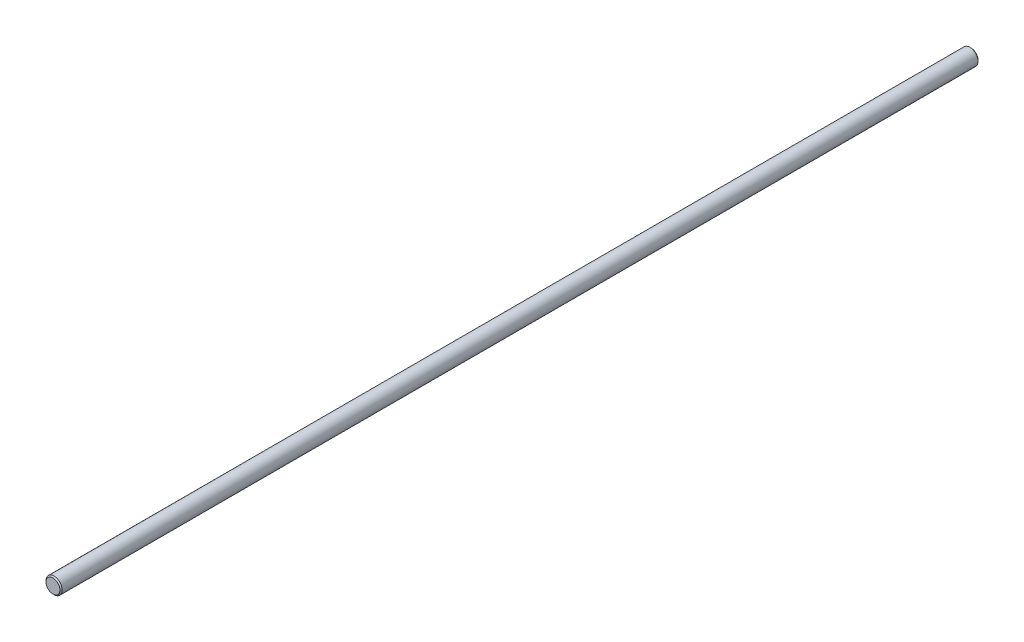
ISO-10303-21;
HEADER;
FILE_DESCRIPTION(('STEP AP214'),'2;1');
FILE_NAME('part.step','',(''),(''),'','','');
FILE_SCHEMA(('AUTOMOTIVE_DESIGN { 1 0 10303 214 1 1 1 1 }'));
ENDSEC;
DATA;
#1=APPLICATION_CONTEXT('core data for automotive mechanical design processes');
#2=APPLICATION_PROTOCOL_DEFINITION('international standard','automotive_design',2000,#1);
#3=PRODUCT_CONTEXT('',#1,'mechanical');
#4=PRODUCT('Part','Part','',(#3));
#5=PRODUCT_RELATED_PRODUCT_CATEGORY('part','',(#4));
#6=PRODUCT_DEFINITION_FORMATION('','',#4);
#7=PRODUCT_DEFINITION_CONTEXT('part definition',#1,'design');
#8=PRODUCT_DEFINITION('design','',#6,#7);
#9=PRODUCT_DEFINITION_SHAPE('','',#8);
#10=(LENGTH_UNIT() NAMED_UNIT(*) SI_UNIT(.MILLI.,.METRE.));
#11=(NAMED_UNIT(*) PLANE_ANGLE_UNIT() SI_UNIT($,.RADIAN.));
#12=(NAMED_UNIT(*) SI_UNIT($,.STERADIAN.) SOLID_ANGLE_UNIT());
#13=UNCERTAINTY_MEASURE_WITH_UNIT(LENGTH_MEASURE(1.E-05),#10,'distance_accuracy_value','');
#14=(GEOMETRIC_REPRESENTATION_CONTEXT(3) GLOBAL_UNCERTAINTY_ASSIGNED_CONTEXT((#13)) GLOBAL_UNIT_ASSIGNED_CONTEXT((#10,
#11,#12)) REPRESENTATION_CONTEXT('',''));
#15=CARTESIAN_POINT('',(0.,0.,0.));
#16=DIRECTION('',(0.,0.,1.));
#17=DIRECTION('',(1.,0.,0.));
#18=AXIS2_PLACEMENT_3D('',#15,#16,#17);
#19=CARTESIAN_POINT('',(0.,0.,-150.));
#20=DIRECTION('',(0.,0.,1.));
#21=DIRECTION('',(1.,0.,0.));
#22=AXIS2_PLACEMENT_3D('',#19,#20,#21);
#23=CYLINDRICAL_SURFACE('',#22,3.);
#24=CARTESIAN_POINT('',(0.,0.,-149.58));
#25=DIRECTION('',(0.,0.,1.));
#26=DIRECTION('',(1.,0.,0.));
#27=AXIS2_PLACEMENT_3D('',#24,#25,#26);
#28=CIRCLE('',#27,3.);
#29=CARTESIAN_POINT('',(3.,0.,-149.58));
#30=VERTEX_POINT('',#29);
#31=EDGE_CURVE('E48',#30,#30,#28,.T.);
#32=CARTESIAN_POINT('',(0.,0.,189.58));
#33=DIRECTION('',(0.,0.,1.));
#34=DIRECTION('',(1.,0.,0.));
#35=AXIS2_PLACEMENT_3D('',#32,#33,#34);
#36=CIRCLE('',#35,3.);
#37=CARTESIAN_POINT('',(3.,0.,189.58));
#38=VERTEX_POINT('',#37);
#39=EDGE_CURVE('E52',#38,#38,#36,.F.);
#40=CARTESIAN_POINT('',(3.,0.,-149.58));
#41=CARTESIAN_POINT('',(3.,0.,-146.047083333333));
#42=CARTESIAN_POINT('',(3.,0.,-142.514166666667));
#43=CARTESIAN_POINT('',(3.,0.,-135.448333333333));
#44=CARTESIAN_POINT('',(3.,0.,-131.915416666667));
#45=CARTESIAN_POINT('',(3.,0.,-124.849583333333));
#46=CARTESIAN_POINT('',(3.,0.,-121.316666666667));
#47=CARTESIAN_POINT('',(3.,0.,-114.250833333333));
#48=CARTESIAN_POINT('',(3.,0.,-110.717916666667));
#49=CARTESIAN_POINT('',(3.,0.,-103.652083333333));
#50=CARTESIAN_POINT('',(3.,0.,-100.119166666667));
#51=CARTESIAN_POINT('',(3.,0.,-93.0533333333334));
#52=CARTESIAN_POINT('',(3.,0.,-89.5204166666667));
#53=CARTESIAN_POINT('',(3.,0.,-82.4545833333334));
#54=CARTESIAN_POINT('',(3.,0.,-78.9216666666667));
#55=CARTESIAN_POINT('',(3.,0.,-71.8558333333334));
#56=CARTESIAN_POINT('',(3.,0.,-68.3229166666667));
#57=CARTESIAN_POINT('',(3.,0.,-61.2570833333334));
#58=CARTESIAN_POINT('',(3.,0.,-57.7241666666667));
#59=CARTESIAN_POINT('',(3.,0.,-50.6583333333334));
#60=CARTESIAN_POINT('',(3.,0.,-47.1254166666667));
#61=CARTESIAN_POINT('',(3.,0.,-40.0595833333334));
#62=CARTESIAN_POINT('',(3.,0.,-36.5266666666667));
#63=CARTESIAN_POINT('',(3.,0.,-29.4608333333334));
#64=CARTESIAN_POINT('',(3.,0.,-25.9279166666667));
#65=CARTESIAN_POINT('',(3.,0.,-18.8620833333334));
#66=CARTESIAN_POINT('',(3.,0.,-15.3291666666667));
#67=CARTESIAN_POINT('',(3.,0.,-8.26333333333337));
#68=CARTESIAN_POINT('',(3.,0.,-4.73041666666671));
#69=CARTESIAN_POINT('',(3.,0.,2.33541666666662));
#70=CARTESIAN_POINT('',(3.,0.,5.86833333333328));
#71=CARTESIAN_POINT('',(3.,0.,12.9341666666666));
#72=CARTESIAN_POINT('',(3.,0.,16.4670833333333));
#73=CARTESIAN_POINT('',(3.,0.,23.5329166666666));
#74=CARTESIAN_POINT('',(3.,0.,27.0658333333333));
#75=CARTESIAN_POINT('',(3.,0.,34.1316666666666));
#76=CARTESIAN_POINT('',(3.,0.,37.6645833333333));
#77=CARTESIAN_POINT('',(3.,0.,44.7304166666666));
#78=CARTESIAN_POINT('',(3.,0.,48.2633333333333));
#79=CARTESIAN_POINT('',(3.,0.,55.3291666666666));
#80=CARTESIAN_POINT('',(3.,0.,58.8620833333333));
#81=CARTESIAN_POINT('',(3.,0.,65.9279166666666));
#82=CARTESIAN_POINT('',(3.,0.,69.4608333333333));
#83=CARTESIAN_POINT('',(3.,0.,76.5266666666666));
#84=CARTESIAN_POINT('',(3.,0.,80.0595833333333));
#85=CARTESIAN_POINT('',(3.,0.,87.1254166666667));
#86=CARTESIAN_POINT('',(3.,0.,90.6583333333333));
#87=CARTESIAN_POINT('',(3.,0.,97.7241666666666));
#88=CARTESIAN_POINT('',(3.,0.,101.257083333333));
#89=CARTESIAN_POINT('',(3.,0.,108.322916666667));
#90=CARTESIAN_POINT('',(3.,0.,111.855833333333));
#91=CARTESIAN_POINT('',(3.,0.,118.921666666667));
#92=CARTESIAN_POINT('',(3.,0.,122.454583333333));
#93=CARTESIAN_POINT('',(3.,0.,129.520416666667));
#94=CARTESIAN_POINT('',(3.,0.,133.053333333333));
#95=CARTESIAN_POINT('',(3.,0.,140.119166666667));
#96=CARTESIAN_POINT('',(3.,0.,143.652083333333));
#97=CARTESIAN_POINT('',(3.,0.,150.717916666667));
#98=CARTESIAN_POINT('',(3.,0.,154.250833333333));
#99=CARTESIAN_POINT('',(3.,0.,161.316666666667));
#100=CARTESIAN_POINT('',(3.,0.,164.849583333333));
#101=CARTESIAN_POINT('',(3.,0.,171.915416666667));
#102=CARTESIAN_POINT('',(3.,0.,175.448333333333));
#103=CARTESIAN_POINT('',(3.,0.,182.514166666667));
#104=CARTESIAN_POINT('',(3.,0.,186.047083333333));
#105=CARTESIAN_POINT('',(3.,0.,189.58));
#106=B_SPLINE_CURVE_WITH_KNOTS('',3,(#40,#41,#42,#43,#44,#45,#46,#47,#48,#49,#50,#51,#52,#53,
#54,#55,#56,#57,#58,#59,#60,#61,#62,#63,#64,#65,#66,#67,#68,#69,#70,#71,#72,#73,#74,#75,#76,#77,
#78,#79,#80,#81,#82,#83,#84,#85,#86,#87,#88,#89,#90,#91,#92,#93,#94,#95,#96,#97,#98,#99,#100,
#101,#102,#103,#104,#105),.UNSPECIFIED.,.F.,.F.,(4,2,2,2,2,2,2,2,2,2,2,2,2,2,2,2,2,2,2,2,2,2,2,
2,2,2,2,2,2,2,2,2,4),(0.,10.59875,21.1975,31.79625,42.395,52.99375,63.5925,74.19125,84.79,
95.38875,105.9875,116.58625,127.185,137.78375,148.3825,158.98125,169.58,180.17875,190.7775,
201.37625,211.975,222.57375,233.1725,243.77125,254.37,264.96875,275.5675,286.16625,296.765,
307.36375,317.9625,328.56125,339.16),.UNSPECIFIED.);
#107=EDGE_CURVE('BSEAM37',#30,#38,#106,.T.);
#108=ORIENTED_EDGE('',*,*,#31,.T.);
#109=ORIENTED_EDGE('',*,*,#39,.T.);
#110=ORIENTED_EDGE('',*,*,#107,.T.);
#111=ORIENTED_EDGE('',*,*,#107,.F.);
#112=EDGE_LOOP('',(#108,#110,#109,#111));
#113=FACE_BOUND('',#112,.T.);
#114=ADVANCED_FACE('F37',(#113),#23,.T.);
#115=CARTESIAN_POINT('',(0.,0.,-150.));
#116=DIRECTION('',(0.,0.,1.));
#117=DIRECTION('',(1.,0.,0.));
#118=AXIS2_PLACEMENT_3D('',#115,#116,#117);
#119=PLANE('',#118);
#120=CARTESIAN_POINT('',(0.,0.,-150.));
#121=DIRECTION('',(0.,0.,1.));
#122=DIRECTION('',(1.,0.,0.));
#123=AXIS2_PLACEMENT_3D('',#120,#121,#122);
#124=CIRCLE('',#123,2.58000000000008);
#125=CARTESIAN_POINT('',(2.58000000000007,0.,-150.));
#126=VERTEX_POINT('',#125);
#127=EDGE_CURVE('E44',#126,#126,#124,.F.);
#128=ORIENTED_EDGE('',*,*,#127,.T.);
#129=EDGE_LOOP('',(#128));
#130=FACE_BOUND('',#129,.T.);
#131=ADVANCED_FACE('F68',(#130),#119,.F.);
#132=CARTESIAN_POINT('',(0.,0.,190.));
#133=DIRECTION('',(0.,0.,1.));
#134=DIRECTION('',(1.,0.,0.));
#135=AXIS2_PLACEMENT_3D('',#132,#133,#134);
#136=PLANE('',#135);
#137=CARTESIAN_POINT('',(0.,0.,190.));
#138=DIRECTION('',(0.,0.,1.));
#139=DIRECTION('',(1.,0.,0.));
#140=AXIS2_PLACEMENT_3D('',#137,#138,#139);
#141=CIRCLE('',#140,2.58000000000003);
#142=CARTESIAN_POINT('',(2.58000000000003,0.,190.));
#143=VERTEX_POINT('',#142);
#144=EDGE_CURVE('E10',#143,#143,#141,.T.);
#145=ORIENTED_EDGE('',*,*,#144,.T.);
#146=EDGE_LOOP('',(#145));
#147=FACE_BOUND('',#146,.T.);
#148=ADVANCED_FACE('F65',(#147),#136,.T.);
#149=CARTESIAN_POINT('',(0.,0.,-149.58));
#150=DIRECTION('',(0.,0.,1.));
#151=DIRECTION('',(1.,0.,0.));
#152=AXIS2_PLACEMENT_3D('',#149,#150,#151);
#153=CONICAL_SURFACE('',#152,3.,0.785398163397446);
#154=CARTESIAN_POINT('',(2.58000000000007,0.,-150.));
#155=CARTESIAN_POINT('',(2.58437500000007,0.,-149.995625));
#156=CARTESIAN_POINT('',(2.58875000000007,0.,-149.99125));
#157=CARTESIAN_POINT('',(2.59750000000007,0.,-149.9825));
#158=CARTESIAN_POINT('',(2.60187500000006,0.,-149.978125));
#159=CARTESIAN_POINT('',(2.61062500000006,0.,-149.969375));
#160=CARTESIAN_POINT('',(2.61500000000006,0.,-149.965));
#161=CARTESIAN_POINT('',(2.62375000000006,0.,-149.95625));
#162=CARTESIAN_POINT('',(2.62812500000006,0.,-149.951875));
#163=CARTESIAN_POINT('',(2.63687500000006,0.,-149.943125));
#164=CARTESIAN_POINT('',(2.64125000000005,0.,-149.93875));
#165=CARTESIAN_POINT('',(2.65000000000005,0.,-149.93));
#166=CARTESIAN_POINT('',(2.65437500000006,0.,-149.925625));
#167=CARTESIAN_POINT('',(2.66312500000006,0.,-149.916875));
#168=CARTESIAN_POINT('',(2.66750000000005,0.,-149.9125));
#169=CARTESIAN_POINT('',(2.67625000000005,0.,-149.90375));
#170=CARTESIAN_POINT('',(2.68062500000005,0.,-149.899375));
#171=CARTESIAN_POINT('',(2.68937500000005,0.,-149.890625));
#172=CARTESIAN_POINT('',(2.69375000000005,0.,-149.88625));
#173=CARTESIAN_POINT('',(2.70250000000004,0.,-149.8775));
#174=CARTESIAN_POINT('',(2.70687500000004,0.,-149.873125));
#175=CARTESIAN_POINT('',(2.71562500000004,0.,-149.864375));
#176=CARTESIAN_POINT('',(2.72000000000004,0.,-149.86));
#177=CARTESIAN_POINT('',(2.72875000000004,0.,-149.85125));
#178=CARTESIAN_POINT('',(2.73312500000004,0.,-149.846875));
#179=CARTESIAN_POINT('',(2.74187500000004,0.,-149.838125));
#180=CARTESIAN_POINT('',(2.74625000000004,0.,-149.83375));
#181=CARTESIAN_POINT('',(2.75500000000003,0.,-149.825));
#182=CARTESIAN_POINT('',(2.75937500000003,0.,-149.820625));
#183=CARTESIAN_POINT('',(2.76812500000003,0.,-149.811875));
#184=CARTESIAN_POINT('',(2.77250000000003,0.,-149.8075));
#185=CARTESIAN_POINT('',(2.78125000000003,0.,-149.79875));
#186=CARTESIAN_POINT('',(2.78562500000003,0.,-149.794375));
#187=CARTESIAN_POINT('',(2.79437500000002,0.,-149.785625));
#188=CARTESIAN_POINT('',(2.79875000000003,0.,-149.78125));
#189=CARTESIAN_POINT('',(2.80750000000003,0.,-149.7725));
#190=CARTESIAN_POINT('',(2.81187500000002,0.,-149.768125));
#191=CARTESIAN_POINT('',(2.82062500000002,0.,-149.759375));
#192=CARTESIAN_POINT('',(2.82500000000002,0.,-149.755));
#193=CARTESIAN_POINT('',(2.83375000000002,0.,-149.74625));
#194=CARTESIAN_POINT('',(2.83812500000002,0.,-149.741875));
#195=CARTESIAN_POINT('',(2.84687500000002,0.,-149.733125));
#196=CARTESIAN_POINT('',(2.85125000000001,0.,-149.72875));
#197=CARTESIAN_POINT('',(2.86000000000001,0.,-149.72));
#198=CARTESIAN_POINT('',(2.86437500000001,0.,-149.715625));
#199=CARTESIAN_POINT('',(2.87312500000001,0.,-149.706875));
#200=CARTESIAN_POINT('',(2.87750000000001,0.,-149.7025));
#201=CARTESIAN_POINT('',(2.88625000000001,0.,-149.69375));
#202=CARTESIAN_POINT('',(2.89062500000001,0.,-149.689375));
#203=CARTESIAN_POINT('',(2.89937500000001,0.,-149.680625));
#204=CARTESIAN_POINT('',(2.90375000000001,0.,-149.67625));
#205=CARTESIAN_POINT('',(2.9125,0.,-149.6675));
#206=CARTESIAN_POINT('',(2.916875,0.,-149.663125));
#207=CARTESIAN_POINT('',(2.925625,0.,-149.654375));
#208=CARTESIAN_POINT('',(2.93,0.,-149.65));
#209=CARTESIAN_POINT('',(2.93875,0.,-149.64125));
#210=CARTESIAN_POINT('',(2.943125,0.,-149.636875));
#211=CARTESIAN_POINT('',(2.951875,0.,-149.628125));
#212=CARTESIAN_POINT('',(2.95624999999999,0.,-149.62375));
#213=CARTESIAN_POINT('',(2.96499999999999,0.,-149.615));
#214=CARTESIAN_POINT('',(2.96937499999999,0.,-149.610625));
#215=CARTESIAN_POINT('',(2.97812499999999,0.,-149.601875));
#216=CARTESIAN_POINT('',(2.98249999999999,0.,-149.5975));
#217=CARTESIAN_POINT('',(2.99124999999999,0.,-149.58875));
#218=CARTESIAN_POINT('',(2.99562499999999,0.,-149.584375));
#219=CARTESIAN_POINT('',(2.99999999999999,0.,-149.58));
#220=B_SPLINE_CURVE_WITH_KNOTS('',3,(#154,#155,#156,#157,#158,#159,#160,#161,#162,#163,#164,
#165,#166,#167,#168,#169,#170,#171,#172,#173,#174,#175,#176,#177,#178,#179,#180,#181,#182,#183,
#184,#185,#186,#187,#188,#189,#190,#191,#192,#193,#194,#195,#196,#197,#198,#199,#200,#201,#202,
#203,#204,#205,#206,#207,#208,#209,#210,#211,#212,#213,#214,#215,#216,#217,#218,#219),
.UNSPECIFIED.,.F.,.F.,(4,2,2,2,2,2,2,2,2,2,2,2,2,2,2,2,2,2,2,2,2,2,2,2,2,2,2,2,2,2,2,2,4),(0.,
0.0185615530061274,0.0371231060122744,0.0556846590184215,0.0742462120245682,0.0928077650307153,
0.111369318036843,0.12993087104299,0.148492424049137,0.167053977055284,0.185615530061431,
0.204177083067558,0.222738636073705,0.241300189079852,0.259861742085999,0.278423295092146,
0.296984848098293,0.31554640110442,0.334107954110567,0.352669507116714,0.371231060122861,
0.389792613129008,0.408354166135136,0.426915719141282,0.445477272147429,0.464038825153576,
0.482600378159723,0.501161931165851,0.519723484171998,0.538285037178144,0.556846590184292,
0.575408143190438,0.593969696196585),.UNSPECIFIED.);
#221=EDGE_CURVE('BSEAM61',#126,#30,#220,.T.);
#222=ORIENTED_EDGE('',*,*,#127,.F.);
#223=ORIENTED_EDGE('',*,*,#31,.F.);
#224=ORIENTED_EDGE('',*,*,#221,.T.);
#225=ORIENTED_EDGE('',*,*,#221,.F.);
#226=EDGE_LOOP('',(#222,#224,#223,#225));
#227=FACE_BOUND('',#226,.T.);
#228=ADVANCED_FACE('F61',(#227),#153,.T.);
#229=CARTESIAN_POINT('',(0.,0.,190.));
#230=DIRECTION('',(0.,0.,-1.));
#231=DIRECTION('',(-1.,0.,0.));
#232=AXIS2_PLACEMENT_3D('',#229,#230,#231);
#233=CONICAL_SURFACE('',#232,2.58000000000005,0.785398163397478);
#234=ORIENTED_EDGE('',*,*,#39,.F.);
#235=EDGE_LOOP('',(#234));
#236=FACE_BOUND('',#235,.T.);
#237=ORIENTED_EDGE('',*,*,#144,.F.);
#238=EDGE_LOOP('',(#237));
#239=FACE_BOUND('',#238,.T.);
#240=ADVANCED_FACE('F39',(#236,#239),#233,.T.);
#241=CLOSED_SHELL('',(#114,#131,#148,#228,#240));
#242=MANIFOLD_SOLID_BREP('B2',#241);
#243=ADVANCED_BREP_SHAPE_REPRESENTATION('',(#18,#242),#14);
#244=SHAPE_DEFINITION_REPRESENTATION(#9,#243);
ENDSEC;
END-ISO-10303-21;
